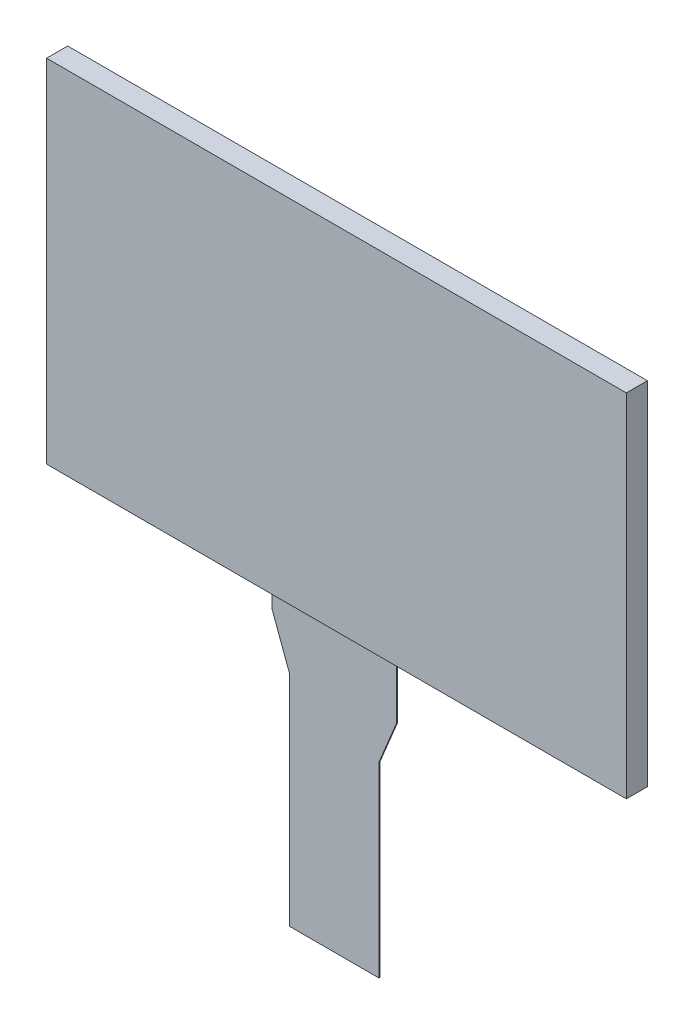
ISO-10303-21;
HEADER;
FILE_DESCRIPTION(('STEP AP214'),'2;1');
FILE_NAME('part.step','',(''),(''),'','','');
FILE_SCHEMA(('AUTOMOTIVE_DESIGN { 1 0 10303 214 1 1 1 1 }'));
ENDSEC;
DATA;
#1=APPLICATION_CONTEXT('core data for automotive mechanical design processes');
#2=APPLICATION_PROTOCOL_DEFINITION('international standard','automotive_design',2000,#1);
#3=PRODUCT_CONTEXT('',#1,'mechanical');
#4=PRODUCT('Part','Part','',(#3));
#5=PRODUCT_RELATED_PRODUCT_CATEGORY('part','',(#4));
#6=PRODUCT_DEFINITION_FORMATION('','',#4);
#7=PRODUCT_DEFINITION_CONTEXT('part definition',#1,'design');
#8=PRODUCT_DEFINITION('design','',#6,#7);
#9=PRODUCT_DEFINITION_SHAPE('','',#8);
#10=(LENGTH_UNIT() NAMED_UNIT(*) SI_UNIT(.MILLI.,.METRE.));
#11=(NAMED_UNIT(*) PLANE_ANGLE_UNIT() SI_UNIT($,.RADIAN.));
#12=(NAMED_UNIT(*) SI_UNIT($,.STERADIAN.) SOLID_ANGLE_UNIT());
#13=UNCERTAINTY_MEASURE_WITH_UNIT(LENGTH_MEASURE(1.E-05),#10,'distance_accuracy_value','');
#14=(GEOMETRIC_REPRESENTATION_CONTEXT(3) GLOBAL_UNCERTAINTY_ASSIGNED_CONTEXT((#13)) GLOBAL_UNIT_ASSIGNED_CONTEXT((#10,
#11,#12)) REPRESENTATION_CONTEXT('',''));
#15=CARTESIAN_POINT('',(0.,0.,0.));
#16=DIRECTION('',(0.,0.,1.));
#17=DIRECTION('',(1.,0.,0.));
#18=AXIS2_PLACEMENT_3D('',#15,#16,#17);
#19=CARTESIAN_POINT('',(-82.45,-50.,6.));
#20=DIRECTION('',(0.,1.,0.));
#21=DIRECTION('',(-1.,0.,0.));
#22=AXIS2_PLACEMENT_3D('',#19,#20,#21);
#23=PLANE('',#22);
#24=DIRECTION('',(1.,0.,0.));
#25=VECTOR('',#24,1.);
#26=CARTESIAN_POINT('',(-82.45,-50.,0.));
#27=LINE('',#26,#25);
#28=CARTESIAN_POINT('',(-82.45,-50.,0.));
#29=VERTEX_POINT('',#28);
#30=CARTESIAN_POINT('',(82.45,-50.,0.));
#31=VERTEX_POINT('',#30);
#32=EDGE_CURVE('E267',#29,#31,#27,.T.);
#33=ORIENTED_EDGE('',*,*,#32,.T.);
#34=DIRECTION('',(0.,0.,-1.));
#35=VECTOR('',#34,1.);
#36=CARTESIAN_POINT('',(82.45,-50.,6.));
#37=LINE('',#36,#35);
#38=CARTESIAN_POINT('',(82.45,-50.,6.));
#39=VERTEX_POINT('',#38);
#40=EDGE_CURVE('E181',#39,#31,#37,.T.);
#41=ORIENTED_EDGE('',*,*,#40,.F.);
#42=DIRECTION('',(1.,0.,0.));
#43=VECTOR('',#42,1.);
#44=CARTESIAN_POINT('',(-82.45,-50.,6.));
#45=LINE('',#44,#43);
#46=CARTESIAN_POINT('',(-82.45,-50.,6.));
#47=VERTEX_POINT('',#46);
#48=EDGE_CURVE('E257',#47,#39,#45,.T.);
#49=ORIENTED_EDGE('',*,*,#48,.F.);
#50=DIRECTION('',(0.,0.,-1.));
#51=VECTOR('',#50,1.);
#52=CARTESIAN_POINT('',(-82.45,-50.,6.));
#53=LINE('',#52,#51);
#54=EDGE_CURVE('E176',#47,#29,#53,.T.);
#55=ORIENTED_EDGE('',*,*,#54,.T.);
#56=EDGE_LOOP('',(#33,#41,#49,#55));
#57=FACE_BOUND('',#56,.T.);
#58=DIRECTION('',(0.,0.,-1.));
#59=VECTOR('',#58,1.);
#60=CARTESIAN_POINT('',(-19.25,-50.,5.15));
#61=LINE('',#60,#59);
#62=CARTESIAN_POINT('',(-19.25,-50.,5.15));
#63=VERTEX_POINT('',#62);
#64=CARTESIAN_POINT('',(-19.25,-50.,4.85));
#65=VERTEX_POINT('',#64);
#66=EDGE_CURVE('E209',#63,#65,#61,.T.);
#67=ORIENTED_EDGE('',*,*,#66,.F.);
#68=DIRECTION('',(-1.,0.,0.));
#69=VECTOR('',#68,1.);
#70=CARTESIAN_POINT('',(-19.25,-50.,5.15));
#71=LINE('',#70,#69);
#72=CARTESIAN_POINT('',(16.25,-50.,5.15));
#73=VERTEX_POINT('',#72);
#74=EDGE_CURVE('E199',#73,#63,#71,.T.);
#75=ORIENTED_EDGE('',*,*,#74,.F.);
#76=DIRECTION('',(0.,0.,1.));
#77=VECTOR('',#76,1.);
#78=CARTESIAN_POINT('',(16.25,-50.,5.15));
#79=LINE('',#78,#77);
#80=CARTESIAN_POINT('',(16.25,-50.,4.85));
#81=VERTEX_POINT('',#80);
#82=EDGE_CURVE('E204',#81,#73,#79,.T.);
#83=ORIENTED_EDGE('',*,*,#82,.F.);
#84=DIRECTION('',(1.,0.,0.));
#85=VECTOR('',#84,1.);
#86=CARTESIAN_POINT('',(-19.25,-50.,4.85));
#87=LINE('',#86,#85);
#88=EDGE_CURVE('E212',#65,#81,#87,.T.);
#89=ORIENTED_EDGE('',*,*,#88,.F.);
#90=EDGE_LOOP('',(#67,#75,#83,#89));
#91=FACE_BOUND('',#90,.T.);
#92=ADVANCED_FACE('F33',(#57,#91),#23,.F.);
#93=CARTESIAN_POINT('',(0.,0.,0.));
#94=DIRECTION('',(0.,0.,1.));
#95=DIRECTION('',(1.,0.,0.));
#96=AXIS2_PLACEMENT_3D('',#93,#94,#95);
#97=PLANE('',#96);
#98=DIRECTION('',(0.,-1.,0.));
#99=VECTOR('',#98,1.);
#100=CARTESIAN_POINT('',(-82.45,50.,0.));
#101=LINE('',#100,#99);
#102=CARTESIAN_POINT('',(-82.45,50.,0.));
#103=VERTEX_POINT('',#102);
#104=EDGE_CURVE('E253',#103,#29,#101,.T.);
#105=ORIENTED_EDGE('',*,*,#104,.F.);
#106=DIRECTION('',(-1.,0.,0.));
#107=VECTOR('',#106,1.);
#108=CARTESIAN_POINT('',(-82.45,50.,0.));
#109=LINE('',#108,#107);
#110=CARTESIAN_POINT('',(82.45,50.,0.));
#111=VERTEX_POINT('',#110);
#112=EDGE_CURVE('E258',#111,#103,#109,.T.);
#113=ORIENTED_EDGE('',*,*,#112,.F.);
#114=DIRECTION('',(0.,1.,0.));
#115=VECTOR('',#114,1.);
#116=CARTESIAN_POINT('',(82.45,50.,0.));
#117=LINE('',#116,#115);
#118=EDGE_CURVE('E269',#31,#111,#117,.T.);
#119=ORIENTED_EDGE('',*,*,#118,.F.);
#120=ORIENTED_EDGE('',*,*,#32,.F.);
#121=EDGE_LOOP('',(#105,#113,#119,#120));
#122=FACE_BOUND('',#121,.T.);
#123=DIRECTION('',(0.,-1.,0.));
#124=VECTOR('',#123,1.);
#125=CARTESIAN_POINT('',(-76.96,46.43,0.));
#126=LINE('',#125,#124);
#127=CARTESIAN_POINT('',(-76.96,46.43,0.));
#128=VERTEX_POINT('',#127);
#129=CARTESIAN_POINT('',(-76.96,-42.67,0.));
#130=VERTEX_POINT('',#129);
#131=EDGE_CURVE('E222',#128,#130,#126,.T.);
#132=ORIENTED_EDGE('',*,*,#131,.T.);
#133=DIRECTION('',(1.,0.,0.));
#134=VECTOR('',#133,1.);
#135=CARTESIAN_POINT('',(-76.96,-42.67,0.));
#136=LINE('',#135,#134);
#137=CARTESIAN_POINT('',(79.74,-42.67,0.));
#138=VERTEX_POINT('',#137);
#139=EDGE_CURVE('E236',#130,#138,#136,.T.);
#140=ORIENTED_EDGE('',*,*,#139,.T.);
#141=DIRECTION('',(0.,1.,0.));
#142=VECTOR('',#141,1.);
#143=CARTESIAN_POINT('',(79.74,46.43,0.));
#144=LINE('',#143,#142);
#145=CARTESIAN_POINT('',(79.74,46.43,0.));
#146=VERTEX_POINT('',#145);
#147=EDGE_CURVE('E239',#138,#146,#144,.T.);
#148=ORIENTED_EDGE('',*,*,#147,.T.);
#149=DIRECTION('',(-1.,0.,0.));
#150=VECTOR('',#149,1.);
#151=CARTESIAN_POINT('',(-76.96,46.43,0.));
#152=LINE('',#151,#150);
#153=EDGE_CURVE('E227',#146,#128,#152,.T.);
#154=ORIENTED_EDGE('',*,*,#153,.T.);
#155=EDGE_LOOP('',(#132,#140,#148,#154));
#156=FACE_BOUND('',#155,.T.);
#157=ADVANCED_FACE('F287',(#122,#156),#97,.F.);
#158=CARTESIAN_POINT('',(-82.45,50.,6.));
#159=DIRECTION('',(1.,0.,0.));
#160=DIRECTION('',(0.,0.,-1.));
#161=AXIS2_PLACEMENT_3D('',#158,#159,#160);
#162=PLANE('',#161);
#163=ORIENTED_EDGE('',*,*,#104,.T.);
#164=ORIENTED_EDGE('',*,*,#54,.F.);
#165=DIRECTION('',(0.,-1.,0.));
#166=VECTOR('',#165,1.);
#167=CARTESIAN_POINT('',(-82.45,50.,6.));
#168=LINE('',#167,#166);
#169=CARTESIAN_POINT('',(-82.45,50.,6.));
#170=VERTEX_POINT('',#169);
#171=EDGE_CURVE('E254',#170,#47,#168,.T.);
#172=ORIENTED_EDGE('',*,*,#171,.F.);
#173=DIRECTION('',(0.,0.,-1.));
#174=VECTOR('',#173,1.);
#175=CARTESIAN_POINT('',(-82.45,50.,6.));
#176=LINE('',#175,#174);
#177=EDGE_CURVE('E264',#170,#103,#176,.T.);
#178=ORIENTED_EDGE('',*,*,#177,.T.);
#179=EDGE_LOOP('',(#163,#164,#172,#178));
#180=FACE_BOUND('',#179,.T.);
#181=ADVANCED_FACE('F35',(#180),#162,.F.);
#182=CARTESIAN_POINT('',(82.45,50.,6.));
#183=DIRECTION('',(-1.,0.,0.));
#184=DIRECTION('',(0.,0.,1.));
#185=AXIS2_PLACEMENT_3D('',#182,#183,#184);
#186=PLANE('',#185);
#187=ORIENTED_EDGE('',*,*,#118,.T.);
#188=DIRECTION('',(0.,0.,-1.));
#189=VECTOR('',#188,1.);
#190=CARTESIAN_POINT('',(82.45,50.,6.));
#191=LINE('',#190,#189);
#192=CARTESIAN_POINT('',(82.45,50.,6.));
#193=VERTEX_POINT('',#192);
#194=EDGE_CURVE('E274',#193,#111,#191,.T.);
#195=ORIENTED_EDGE('',*,*,#194,.F.);
#196=DIRECTION('',(0.,1.,0.));
#197=VECTOR('',#196,1.);
#198=CARTESIAN_POINT('',(82.45,50.,6.));
#199=LINE('',#198,#197);
#200=EDGE_CURVE('E260',#39,#193,#199,.T.);
#201=ORIENTED_EDGE('',*,*,#200,.F.);
#202=ORIENTED_EDGE('',*,*,#40,.T.);
#203=EDGE_LOOP('',(#187,#195,#201,#202));
#204=FACE_BOUND('',#203,.T.);
#205=ADVANCED_FACE('F281',(#204),#186,.F.);
#206=CARTESIAN_POINT('',(-82.45,50.,6.));
#207=DIRECTION('',(0.,-1.,0.));
#208=DIRECTION('',(1.,0.,0.));
#209=AXIS2_PLACEMENT_3D('',#206,#207,#208);
#210=PLANE('',#209);
#211=ORIENTED_EDGE('',*,*,#112,.T.);
#212=ORIENTED_EDGE('',*,*,#177,.F.);
#213=DIRECTION('',(-1.,0.,0.));
#214=VECTOR('',#213,1.);
#215=CARTESIAN_POINT('',(-82.45,50.,6.));
#216=LINE('',#215,#214);
#217=EDGE_CURVE('E262',#193,#170,#216,.T.);
#218=ORIENTED_EDGE('',*,*,#217,.F.);
#219=ORIENTED_EDGE('',*,*,#194,.T.);
#220=EDGE_LOOP('',(#211,#212,#218,#219));
#221=FACE_BOUND('',#220,.T.);
#222=ADVANCED_FACE('F291',(#221),#210,.F.);
#223=CARTESIAN_POINT('',(0.,0.,6.));
#224=DIRECTION('',(0.,0.,1.));
#225=DIRECTION('',(1.,0.,0.));
#226=AXIS2_PLACEMENT_3D('',#223,#224,#225);
#227=PLANE('',#226);
#228=ORIENTED_EDGE('',*,*,#171,.T.);
#229=ORIENTED_EDGE('',*,*,#48,.T.);
#230=ORIENTED_EDGE('',*,*,#200,.T.);
#231=ORIENTED_EDGE('',*,*,#217,.T.);
#232=EDGE_LOOP('',(#228,#229,#230,#231));
#233=FACE_BOUND('',#232,.T.);
#234=ADVANCED_FACE('F297',(#233),#227,.T.);
#235=CARTESIAN_POINT('',(-76.96,46.43,0.1));
#236=DIRECTION('',(1.,0.,0.));
#237=DIRECTION('',(0.,1.,0.));
#238=AXIS2_PLACEMENT_3D('',#235,#236,#237);
#239=PLANE('',#238);
#240=ORIENTED_EDGE('',*,*,#131,.F.);
#241=DIRECTION('',(0.,0.,-1.));
#242=VECTOR('',#241,1.);
#243=CARTESIAN_POINT('',(-76.96,46.43,0.1));
#244=LINE('',#243,#242);
#245=CARTESIAN_POINT('',(-76.96,46.43,0.1));
#246=VERTEX_POINT('',#245);
#247=EDGE_CURVE('E233',#246,#128,#244,.T.);
#248=ORIENTED_EDGE('',*,*,#247,.F.);
#249=DIRECTION('',(0.,-1.,0.));
#250=VECTOR('',#249,1.);
#251=CARTESIAN_POINT('',(-76.96,46.43,0.1));
#252=LINE('',#251,#250);
#253=CARTESIAN_POINT('',(-76.96,-42.67,0.1));
#254=VERTEX_POINT('',#253);
#255=EDGE_CURVE('E223',#246,#254,#252,.T.);
#256=ORIENTED_EDGE('',*,*,#255,.T.);
#257=DIRECTION('',(0.,0.,-1.));
#258=VECTOR('',#257,1.);
#259=CARTESIAN_POINT('',(-76.96,-42.67,0.1));
#260=LINE('',#259,#258);
#261=EDGE_CURVE('E250',#254,#130,#260,.T.);
#262=ORIENTED_EDGE('',*,*,#261,.T.);
#263=EDGE_LOOP('',(#240,#248,#256,#262));
#264=FACE_BOUND('',#263,.T.);
#265=ADVANCED_FACE('F385',(#264),#239,.T.);
#266=CARTESIAN_POINT('',(-76.96,-42.67,0.1));
#267=DIRECTION('',(0.,1.,0.));
#268=DIRECTION('',(-1.,0.,0.));
#269=AXIS2_PLACEMENT_3D('',#266,#267,#268);
#270=PLANE('',#269);
#271=ORIENTED_EDGE('',*,*,#139,.F.);
#272=ORIENTED_EDGE('',*,*,#261,.F.);
#273=DIRECTION('',(1.,0.,0.));
#274=VECTOR('',#273,1.);
#275=CARTESIAN_POINT('',(-76.96,-42.67,0.1));
#276=LINE('',#275,#274);
#277=CARTESIAN_POINT('',(79.74,-42.67,0.1));
#278=VERTEX_POINT('',#277);
#279=EDGE_CURVE('E226',#254,#278,#276,.T.);
#280=ORIENTED_EDGE('',*,*,#279,.T.);
#281=DIRECTION('',(0.,0.,-1.));
#282=VECTOR('',#281,1.);
#283=CARTESIAN_POINT('',(79.74,-42.67,0.1));
#284=LINE('',#283,#282);
#285=EDGE_CURVE('E248',#278,#138,#284,.T.);
#286=ORIENTED_EDGE('',*,*,#285,.T.);
#287=EDGE_LOOP('',(#271,#272,#280,#286));
#288=FACE_BOUND('',#287,.T.);
#289=ADVANCED_FACE('F381',(#288),#270,.T.);
#290=CARTESIAN_POINT('',(79.74,46.43,0.1));
#291=DIRECTION('',(-1.,0.,0.));
#292=DIRECTION('',(0.,-1.,0.));
#293=AXIS2_PLACEMENT_3D('',#290,#291,#292);
#294=PLANE('',#293);
#295=ORIENTED_EDGE('',*,*,#147,.F.);
#296=ORIENTED_EDGE('',*,*,#285,.F.);
#297=DIRECTION('',(0.,1.,0.));
#298=VECTOR('',#297,1.);
#299=CARTESIAN_POINT('',(79.74,46.43,0.1));
#300=LINE('',#299,#298);
#301=CARTESIAN_POINT('',(79.74,46.43,0.1));
#302=VERTEX_POINT('',#301);
#303=EDGE_CURVE('E229',#278,#302,#300,.T.);
#304=ORIENTED_EDGE('',*,*,#303,.T.);
#305=DIRECTION('',(0.,0.,-1.));
#306=VECTOR('',#305,1.);
#307=CARTESIAN_POINT('',(79.74,46.43,0.1));
#308=LINE('',#307,#306);
#309=EDGE_CURVE('E246',#302,#146,#308,.T.);
#310=ORIENTED_EDGE('',*,*,#309,.T.);
#311=EDGE_LOOP('',(#295,#296,#304,#310));
#312=FACE_BOUND('',#311,.T.);
#313=ADVANCED_FACE('F377',(#312),#294,.T.);
#314=CARTESIAN_POINT('',(-76.96,46.43,0.1));
#315=DIRECTION('',(0.,-1.,0.));
#316=DIRECTION('',(0.,0.,-1.));
#317=AXIS2_PLACEMENT_3D('',#314,#315,#316);
#318=PLANE('',#317);
#319=ORIENTED_EDGE('',*,*,#153,.F.);
#320=ORIENTED_EDGE('',*,*,#309,.F.);
#321=DIRECTION('',(-1.,0.,0.));
#322=VECTOR('',#321,1.);
#323=CARTESIAN_POINT('',(-76.96,46.43,0.1));
#324=LINE('',#323,#322);
#325=EDGE_CURVE('E231',#302,#246,#324,.T.);
#326=ORIENTED_EDGE('',*,*,#325,.T.);
#327=ORIENTED_EDGE('',*,*,#247,.T.);
#328=EDGE_LOOP('',(#319,#320,#326,#327));
#329=FACE_BOUND('',#328,.T.);
#330=ADVANCED_FACE('F373',(#329),#318,.T.);
#331=CARTESIAN_POINT('',(0.,0.,0.1));
#332=DIRECTION('',(0.,0.,1.));
#333=DIRECTION('',(1.,0.,0.));
#334=AXIS2_PLACEMENT_3D('',#331,#332,#333);
#335=PLANE('',#334);
#336=ORIENTED_EDGE('',*,*,#255,.F.);
#337=ORIENTED_EDGE('',*,*,#325,.F.);
#338=ORIENTED_EDGE('',*,*,#303,.F.);
#339=ORIENTED_EDGE('',*,*,#279,.F.);
#340=EDGE_LOOP('',(#336,#337,#338,#339));
#341=FACE_BOUND('',#340,.T.);
#342=ADVANCED_FACE('F370',(#341),#335,.F.);
#343=CARTESIAN_POINT('',(-19.25,-130.15,5.15));
#344=DIRECTION('',(1.,0.,0.));
#345=DIRECTION('',(0.,1.,0.));
#346=AXIS2_PLACEMENT_3D('',#343,#344,#345);
#347=PLANE('',#346);
#348=DIRECTION('',(0.,1.,0.));
#349=VECTOR('',#348,1.);
#350=CARTESIAN_POINT('',(-19.25,-130.15,4.85));
#351=LINE('',#350,#349);
#352=CARTESIAN_POINT('',(-19.25,-54.2553641343947,4.85));
#353=VERTEX_POINT('',#352);
#354=EDGE_CURVE('E220',#353,#65,#351,.T.);
#355=ORIENTED_EDGE('',*,*,#354,.F.);
#356=DIRECTION('',(0.,0.,-1.));
#357=VECTOR('',#356,1.);
#358=CARTESIAN_POINT('',(-19.25,-54.2553641343947,6.00000000000001));
#359=LINE('',#358,#357);
#360=CARTESIAN_POINT('',(-19.25,-54.2553641343947,5.15));
#361=VERTEX_POINT('',#360);
#362=EDGE_CURVE('E322',#361,#353,#359,.T.);
#363=ORIENTED_EDGE('',*,*,#362,.F.);
#364=DIRECTION('',(0.,1.,0.));
#365=VECTOR('',#364,1.);
#366=CARTESIAN_POINT('',(-19.25,-130.15,5.15));
#367=LINE('',#366,#365);
#368=EDGE_CURVE('E198',#361,#63,#367,.T.);
#369=ORIENTED_EDGE('',*,*,#368,.T.);
#370=ORIENTED_EDGE('',*,*,#66,.T.);
#371=EDGE_LOOP('',(#355,#363,#369,#370));
#372=FACE_BOUND('',#371,.T.);
#373=ADVANCED_FACE('F321',(#372),#347,.F.);
#374=CARTESIAN_POINT('',(-19.25,-130.15,4.85));
#375=DIRECTION('',(0.,0.,1.));
#376=DIRECTION('',(1.,0.,0.));
#377=AXIS2_PLACEMENT_3D('',#374,#375,#376);
#378=PLANE('',#377);
#379=DIRECTION('',(0.,1.,0.));
#380=VECTOR('',#379,1.);
#381=CARTESIAN_POINT('',(11.25,-130.15,4.85));
#382=LINE('',#381,#380);
#383=CARTESIAN_POINT('',(11.25,-126.35,4.85));
#384=VERTEX_POINT('',#383);
#385=CARTESIAN_POINT('',(11.25,-76.9871793146189,4.85));
#386=VERTEX_POINT('',#385);
#387=EDGE_CURVE('E195',#384,#386,#382,.T.);
#388=ORIENTED_EDGE('',*,*,#387,.F.);
#389=DIRECTION('',(1.,0.,0.));
#390=VECTOR('',#389,1.);
#391=CARTESIAN_POINT('',(11.25,-126.35,4.85));
#392=LINE('',#391,#390);
#393=CARTESIAN_POINT('',(-14.25,-126.35,4.85));
#394=VERTEX_POINT('',#393);
#395=EDGE_CURVE('E164',#394,#384,#392,.T.);
#396=ORIENTED_EDGE('',*,*,#395,.F.);
#397=DIRECTION('',(0.,-1.,0.));
#398=VECTOR('',#397,1.);
#399=CARTESIAN_POINT('',(-14.25,-130.15,4.85));
#400=LINE('',#399,#398);
#401=CARTESIAN_POINT('',(-14.25,-67.7396126039077,4.85));
#402=VERTEX_POINT('',#401);
#403=EDGE_CURVE('E324',#402,#394,#400,.T.);
#404=ORIENTED_EDGE('',*,*,#403,.F.);
#405=DIRECTION('',(0.347671053208722,-0.937616573424733,0.));
#406=VECTOR('',#405,1.);
#407=CARTESIAN_POINT('',(-14.25,-67.7396126039077,4.85));
#408=LINE('',#407,#406);
#409=EDGE_CURVE('E319',#353,#402,#408,.T.);
#410=ORIENTED_EDGE('',*,*,#409,.F.);
#411=ORIENTED_EDGE('',*,*,#354,.T.);
#412=ORIENTED_EDGE('',*,*,#88,.T.);
#413=DIRECTION('',(0.,1.,0.));
#414=VECTOR('',#413,1.);
#415=CARTESIAN_POINT('',(16.25,-130.15,4.85));
#416=LINE('',#415,#414);
#417=CARTESIAN_POINT('',(16.25,-64.8670860259,4.85));
#418=VERTEX_POINT('',#417);
#419=EDGE_CURVE('E218',#418,#81,#416,.T.);
#420=ORIENTED_EDGE('',*,*,#419,.F.);
#421=DIRECTION('',(0.381361005079264,0.924426191648059,0.));
#422=VECTOR('',#421,1.);
#423=CARTESIAN_POINT('',(11.25,-76.9871793146189,4.85));
#424=LINE('',#423,#422);
#425=EDGE_CURVE('E330',#386,#418,#424,.T.);
#426=ORIENTED_EDGE('',*,*,#425,.F.);
#427=EDGE_LOOP('',(#388,#396,#404,#410,#411,#412,#420,#426));
#428=FACE_BOUND('',#427,.T.);
#429=ADVANCED_FACE('F314',(#428),#378,.F.);
#430=CARTESIAN_POINT('',(16.25,-130.15,5.15));
#431=DIRECTION('',(-1.,0.,0.));
#432=DIRECTION('',(0.,-1.,0.));
#433=AXIS2_PLACEMENT_3D('',#430,#431,#432);
#434=PLANE('',#433);
#435=DIRECTION('',(0.,1.,0.));
#436=VECTOR('',#435,1.);
#437=CARTESIAN_POINT('',(16.25,-130.15,5.15));
#438=LINE('',#437,#436);
#439=CARTESIAN_POINT('',(16.25,-64.8670860259,5.15));
#440=VERTEX_POINT('',#439);
#441=EDGE_CURVE('E201',#440,#73,#438,.T.);
#442=ORIENTED_EDGE('',*,*,#441,.F.);
#443=DIRECTION('',(0.,0.,-1.));
#444=VECTOR('',#443,1.);
#445=CARTESIAN_POINT('',(16.25,-64.8670860259,6.00000000000001));
#446=LINE('',#445,#444);
#447=EDGE_CURVE('E310',#440,#418,#446,.T.);
#448=ORIENTED_EDGE('',*,*,#447,.T.);
#449=ORIENTED_EDGE('',*,*,#419,.T.);
#450=ORIENTED_EDGE('',*,*,#82,.T.);
#451=EDGE_LOOP('',(#442,#448,#449,#450));
#452=FACE_BOUND('',#451,.T.);
#453=ADVANCED_FACE('F309',(#452),#434,.F.);
#454=CARTESIAN_POINT('',(-19.25,-130.15,5.15));
#455=DIRECTION('',(0.,0.,-1.));
#456=DIRECTION('',(-1.,0.,0.));
#457=AXIS2_PLACEMENT_3D('',#454,#455,#456);
#458=PLANE('',#457);
#459=DIRECTION('',(0.347671053208722,-0.937616573424733,0.));
#460=VECTOR('',#459,1.);
#461=CARTESIAN_POINT('',(5.49029593455166,-120.97622365255,5.15));
#462=LINE('',#461,#460);
#463=CARTESIAN_POINT('',(-14.25,-67.7396126039077,5.15));
#464=VERTEX_POINT('',#463);
#465=EDGE_CURVE('E11',#361,#464,#462,.T.);
#466=ORIENTED_EDGE('',*,*,#465,.T.);
#467=DIRECTION('',(0.,-1.,0.));
#468=VECTOR('',#467,1.);
#469=CARTESIAN_POINT('',(-14.25,-130.15,5.15));
#470=LINE('',#469,#468);
#471=CARTESIAN_POINT('',(-14.25,-130.15,5.15));
#472=VERTEX_POINT('',#471);
#473=EDGE_CURVE('E188',#464,#472,#470,.T.);
#474=ORIENTED_EDGE('',*,*,#473,.T.);
#475=DIRECTION('',(-1.,0.,0.));
#476=VECTOR('',#475,1.);
#477=CARTESIAN_POINT('',(-19.25,-130.15,5.15));
#478=LINE('',#477,#476);
#479=CARTESIAN_POINT('',(11.25,-130.15,5.15));
#480=VERTEX_POINT('',#479);
#481=EDGE_CURVE('E193',#480,#472,#478,.T.);
#482=ORIENTED_EDGE('',*,*,#481,.F.);
#483=DIRECTION('',(0.,1.,0.));
#484=VECTOR('',#483,1.);
#485=CARTESIAN_POINT('',(11.25,-130.15,5.15));
#486=LINE('',#485,#484);
#487=CARTESIAN_POINT('',(11.25,-76.9871793146189,5.15));
#488=VERTEX_POINT('',#487);
#489=EDGE_CURVE('E56',#480,#488,#486,.T.);
#490=ORIENTED_EDGE('',*,*,#489,.T.);
#491=DIRECTION('',(0.381361005079265,0.924426191648059,0.));
#492=VECTOR('',#491,1.);
#493=CARTESIAN_POINT('',(-11.9278307980417,-133.170673615101,5.15));
#494=LINE('',#493,#492);
#495=EDGE_CURVE('E175',#488,#440,#494,.T.);
#496=ORIENTED_EDGE('',*,*,#495,.T.);
#497=ORIENTED_EDGE('',*,*,#441,.T.);
#498=ORIENTED_EDGE('',*,*,#74,.T.);
#499=ORIENTED_EDGE('',*,*,#368,.F.);
#500=EDGE_LOOP('',(#466,#474,#482,#490,#496,#497,#498,#499));
#501=FACE_BOUND('',#500,.T.);
#502=ADVANCED_FACE('F192',(#501),#458,.F.);
#503=CARTESIAN_POINT('',(0.,-130.15,0.));
#504=DIRECTION('',(0.,-1.,0.));
#505=DIRECTION('',(0.,0.,-1.));
#506=AXIS2_PLACEMENT_3D('',#503,#504,#505);
#507=PLANE('',#506);
#508=DIRECTION('',(-1.,0.,0.));
#509=VECTOR('',#508,1.);
#510=CARTESIAN_POINT('',(11.25,-130.15,4.9));
#511=LINE('',#510,#509);
#512=CARTESIAN_POINT('',(11.25,-130.15,4.9));
#513=VERTEX_POINT('',#512);
#514=CARTESIAN_POINT('',(-14.25,-130.15,4.9));
#515=VERTEX_POINT('',#514);
#516=EDGE_CURVE('E48',#513,#515,#511,.T.);
#517=ORIENTED_EDGE('',*,*,#516,.F.);
#518=DIRECTION('',(0.,0.,-1.));
#519=VECTOR('',#518,1.);
#520=CARTESIAN_POINT('',(11.25,-130.15,0.));
#521=LINE('',#520,#519);
#522=EDGE_CURVE('E170',#480,#513,#521,.T.);
#523=ORIENTED_EDGE('',*,*,#522,.F.);
#524=ORIENTED_EDGE('',*,*,#481,.T.);
#525=DIRECTION('',(0.,0.,1.));
#526=VECTOR('',#525,1.);
#527=CARTESIAN_POINT('',(-14.25,-130.15,0.));
#528=LINE('',#527,#526);
#529=EDGE_CURVE('E41',#515,#472,#528,.T.);
#530=ORIENTED_EDGE('',*,*,#529,.F.);
#531=EDGE_LOOP('',(#517,#523,#524,#530));
#532=FACE_BOUND('',#531,.T.);
#533=ADVANCED_FACE('F168',(#532),#507,.T.);
#534=CARTESIAN_POINT('',(11.25,-76.9871793146189,6.00000000000001));
#535=DIRECTION('',(-0.924426191648059,0.381361005079264,0.));
#536=DIRECTION('',(-0.381361005079265,-0.924426191648059,0.));
#537=AXIS2_PLACEMENT_3D('',#534,#535,#536);
#538=PLANE('',#537);
#539=DIRECTION('',(0.,0.,-1.));
#540=VECTOR('',#539,1.);
#541=CARTESIAN_POINT('',(11.25,-76.9871793146189,6.00000000000001));
#542=LINE('',#541,#540);
#543=EDGE_CURVE('E332',#488,#386,#542,.T.);
#544=ORIENTED_EDGE('',*,*,#543,.T.);
#545=ORIENTED_EDGE('',*,*,#425,.T.);
#546=ORIENTED_EDGE('',*,*,#447,.F.);
#547=ORIENTED_EDGE('',*,*,#495,.F.);
#548=EDGE_LOOP('',(#544,#545,#546,#547));
#549=FACE_BOUND('',#548,.T.);
#550=ADVANCED_FACE('F335',(#549),#538,.F.);
#551=CARTESIAN_POINT('',(11.25,-130.15,6.00000000000001));
#552=DIRECTION('',(-1.,0.,0.));
#553=DIRECTION('',(0.,0.,1.));
#554=AXIS2_PLACEMENT_3D('',#551,#552,#553);
#555=PLANE('',#554);
#556=DIRECTION('',(0.,-1.,0.));
#557=VECTOR('',#556,1.);
#558=CARTESIAN_POINT('',(11.25,-130.15,4.9));
#559=LINE('',#558,#557);
#560=CARTESIAN_POINT('',(11.25,-126.35,4.9));
#561=VERTEX_POINT('',#560);
#562=EDGE_CURVE('E159',#561,#513,#559,.T.);
#563=ORIENTED_EDGE('',*,*,#562,.F.);
#564=DIRECTION('',(0.,0.,-1.));
#565=VECTOR('',#564,1.);
#566=CARTESIAN_POINT('',(11.25,-126.35,4.9));
#567=LINE('',#566,#565);
#568=EDGE_CURVE('E337',#561,#384,#567,.T.);
#569=ORIENTED_EDGE('',*,*,#568,.T.);
#570=ORIENTED_EDGE('',*,*,#387,.T.);
#571=ORIENTED_EDGE('',*,*,#543,.F.);
#572=ORIENTED_EDGE('',*,*,#489,.F.);
#573=ORIENTED_EDGE('',*,*,#522,.T.);
#574=EDGE_LOOP('',(#563,#569,#570,#571,#572,#573));
#575=FACE_BOUND('',#574,.T.);
#576=ADVANCED_FACE('F174',(#575),#555,.F.);
#577=CARTESIAN_POINT('',(-14.25,-67.7396126039077,6.00000000000001));
#578=DIRECTION('',(0.937616573424733,0.347671053208722,0.));
#579=DIRECTION('',(-0.347671053208722,0.937616573424733,0.));
#580=AXIS2_PLACEMENT_3D('',#577,#578,#579);
#581=PLANE('',#580);
#582=ORIENTED_EDGE('',*,*,#362,.T.);
#583=ORIENTED_EDGE('',*,*,#409,.T.);
#584=DIRECTION('',(0.,0.,-1.));
#585=VECTOR('',#584,1.);
#586=CARTESIAN_POINT('',(-14.25,-67.7396126039077,6.00000000000001));
#587=LINE('',#586,#585);
#588=EDGE_CURVE('E196',#464,#402,#587,.T.);
#589=ORIENTED_EDGE('',*,*,#588,.F.);
#590=ORIENTED_EDGE('',*,*,#465,.F.);
#591=EDGE_LOOP('',(#582,#583,#589,#590));
#592=FACE_BOUND('',#591,.T.);
#593=ADVANCED_FACE('F347',(#592),#581,.F.);
#594=CARTESIAN_POINT('',(-14.25,-130.15,6.00000000000001));
#595=DIRECTION('',(1.,0.,0.));
#596=DIRECTION('',(0.,0.,-1.));
#597=AXIS2_PLACEMENT_3D('',#594,#595,#596);
#598=PLANE('',#597);
#599=ORIENTED_EDGE('',*,*,#403,.T.);
#600=DIRECTION('',(0.,0.,-1.));
#601=VECTOR('',#600,1.);
#602=CARTESIAN_POINT('',(-14.25,-126.35,4.9));
#603=LINE('',#602,#601);
#604=CARTESIAN_POINT('',(-14.25,-126.35,4.9));
#605=VERTEX_POINT('',#604);
#606=EDGE_CURVE('E339',#605,#394,#603,.T.);
#607=ORIENTED_EDGE('',*,*,#606,.F.);
#608=DIRECTION('',(0.,1.,0.));
#609=VECTOR('',#608,1.);
#610=CARTESIAN_POINT('',(-14.25,-130.15,4.9));
#611=LINE('',#610,#609);
#612=EDGE_CURVE('E172',#515,#605,#611,.T.);
#613=ORIENTED_EDGE('',*,*,#612,.F.);
#614=ORIENTED_EDGE('',*,*,#529,.T.);
#615=ORIENTED_EDGE('',*,*,#473,.F.);
#616=ORIENTED_EDGE('',*,*,#588,.T.);
#617=EDGE_LOOP('',(#599,#607,#613,#614,#615,#616));
#618=FACE_BOUND('',#617,.T.);
#619=ADVANCED_FACE('F187',(#618),#598,.F.);
#620=CARTESIAN_POINT('',(11.25,-126.35,4.9));
#621=DIRECTION('',(0.,1.,0.));
#622=DIRECTION('',(0.,0.,1.));
#623=AXIS2_PLACEMENT_3D('',#620,#621,#622);
#624=PLANE('',#623);
#625=ORIENTED_EDGE('',*,*,#395,.T.);
#626=ORIENTED_EDGE('',*,*,#568,.F.);
#627=DIRECTION('',(1.,0.,0.));
#628=VECTOR('',#627,1.);
#629=CARTESIAN_POINT('',(11.25,-126.35,4.9));
#630=LINE('',#629,#628);
#631=EDGE_CURVE('E162',#605,#561,#630,.T.);
#632=ORIENTED_EDGE('',*,*,#631,.F.);
#633=ORIENTED_EDGE('',*,*,#606,.T.);
#634=EDGE_LOOP('',(#625,#626,#632,#633));
#635=FACE_BOUND('',#634,.T.);
#636=ADVANCED_FACE('F346',(#635),#624,.F.);
#637=CARTESIAN_POINT('',(0.,0.,4.9));
#638=DIRECTION('',(0.,0.,1.));
#639=DIRECTION('',(1.,0.,0.));
#640=AXIS2_PLACEMENT_3D('',#637,#638,#639);
#641=PLANE('',#640);
#642=ORIENTED_EDGE('',*,*,#562,.T.);
#643=ORIENTED_EDGE('',*,*,#516,.T.);
#644=ORIENTED_EDGE('',*,*,#612,.T.);
#645=ORIENTED_EDGE('',*,*,#631,.T.);
#646=EDGE_LOOP('',(#642,#643,#644,#645));
#647=FACE_BOUND('',#646,.T.);
#648=ADVANCED_FACE('F160',(#647),#641,.F.);
#649=CLOSED_SHELL('',(#92,#157,#181,#205,#222,#234,#265,#289,#313,#330,#342,#373,#429,#453,#502,
#533,#550,#576,#593,#619,#636,#648));
#650=MANIFOLD_SOLID_BREP('B2',#649);
#651=ADVANCED_BREP_SHAPE_REPRESENTATION('',(#18,#650),#14);
#652=SHAPE_DEFINITION_REPRESENTATION(#9,#651);
ENDSEC;
END-ISO-10303-21;
